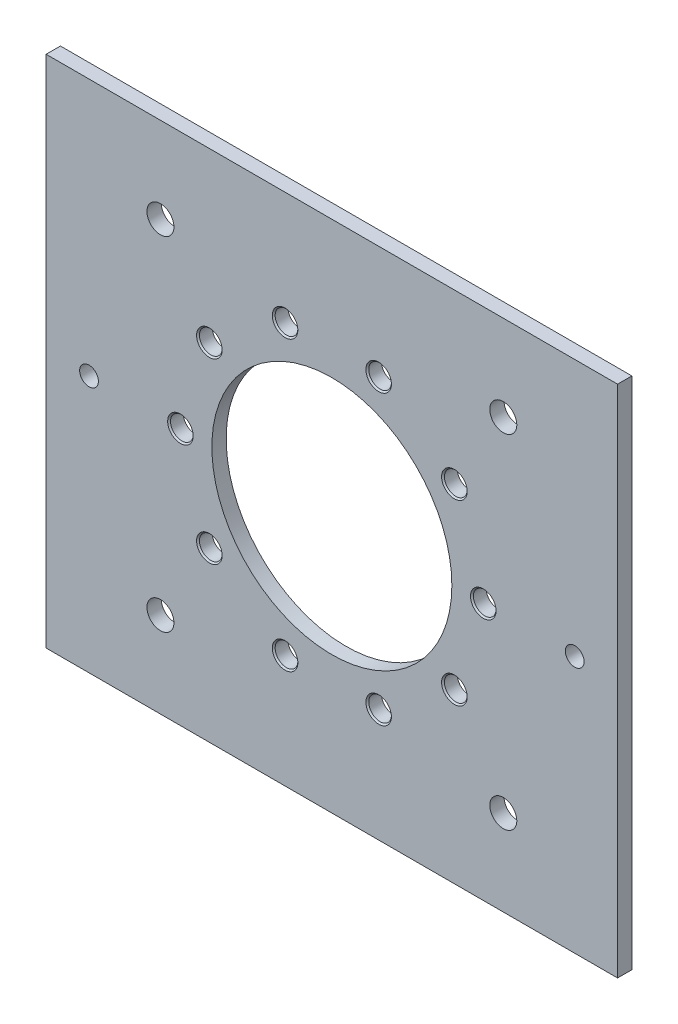
ISO-10303-21;
HEADER;
FILE_DESCRIPTION(('STEP AP214'),'2;1');
FILE_NAME('part.step','',(''),(''),'','','');
FILE_SCHEMA(('AUTOMOTIVE_DESIGN { 1 0 10303 214 1 1 1 1 }'));
ENDSEC;
DATA;
#1=APPLICATION_CONTEXT('core data for automotive mechanical design processes');
#2=APPLICATION_PROTOCOL_DEFINITION('international standard','automotive_design',2000,#1);
#3=PRODUCT_CONTEXT('',#1,'mechanical');
#4=PRODUCT('Part','Part','',(#3));
#5=PRODUCT_RELATED_PRODUCT_CATEGORY('part','',(#4));
#6=PRODUCT_DEFINITION_FORMATION('','',#4);
#7=PRODUCT_DEFINITION_CONTEXT('part definition',#1,'design');
#8=PRODUCT_DEFINITION('design','',#6,#7);
#9=PRODUCT_DEFINITION_SHAPE('','',#8);
#10=(LENGTH_UNIT() NAMED_UNIT(*) SI_UNIT(.MILLI.,.METRE.));
#11=(NAMED_UNIT(*) PLANE_ANGLE_UNIT() SI_UNIT($,.RADIAN.));
#12=(NAMED_UNIT(*) SI_UNIT($,.STERADIAN.) SOLID_ANGLE_UNIT());
#13=UNCERTAINTY_MEASURE_WITH_UNIT(LENGTH_MEASURE(1.E-05),#10,'distance_accuracy_value','');
#14=(GEOMETRIC_REPRESENTATION_CONTEXT(3) GLOBAL_UNCERTAINTY_ASSIGNED_CONTEXT((#13)) GLOBAL_UNIT_ASSIGNED_CONTEXT((#10,
#11,#12)) REPRESENTATION_CONTEXT('',''));
#15=CARTESIAN_POINT('',(0.,0.,0.));
#16=DIRECTION('',(0.,0.,1.));
#17=DIRECTION('',(1.,0.,0.));
#18=AXIS2_PLACEMENT_3D('',#15,#16,#17);
#19=CARTESIAN_POINT('',(0.,0.,6.35));
#20=DIRECTION('',(0.,0.,-1.));
#21=DIRECTION('',(-1.,0.,0.));
#22=AXIS2_PLACEMENT_3D('',#19,#20,#21);
#23=PLANE('',#22);
#24=CARTESIAN_POINT('',(-107.95,0.,6.35));
#25=DIRECTION('',(0.,0.,-1.));
#26=DIRECTION('',(-1.,0.,0.));
#27=AXIS2_PLACEMENT_3D('',#24,#25,#26);
#28=CIRCLE('',#27,4.1656);
#29=CARTESIAN_POINT('',(-112.1156,0.,6.35));
#30=VERTEX_POINT('',#29);
#31=EDGE_CURVE('E289',#30,#30,#28,.T.);
#32=ORIENTED_EDGE('',*,*,#31,.T.);
#33=EDGE_LOOP('',(#32));
#34=FACE_BOUND('',#33,.T.);
#35=CARTESIAN_POINT('',(107.95,0.,6.35));
#36=DIRECTION('',(0.,0.,-1.));
#37=DIRECTION('',(1.,0.,0.));
#38=AXIS2_PLACEMENT_3D('',#35,#36,#37);
#39=CIRCLE('',#38,4.1656);
#40=CARTESIAN_POINT('',(112.1156,0.,6.35));
#41=VERTEX_POINT('',#40);
#42=EDGE_CURVE('E294',#41,#41,#39,.T.);
#43=ORIENTED_EDGE('',*,*,#42,.T.);
#44=EDGE_LOOP('',(#43));
#45=FACE_BOUND('',#44,.T.);
#46=CARTESIAN_POINT('',(-76.2,76.2,6.35));
#47=DIRECTION('',(0.,0.,-1.));
#48=DIRECTION('',(-1.,0.,0.));
#49=AXIS2_PLACEMENT_3D('',#46,#47,#48);
#50=CIRCLE('',#49,6.00000000000001);
#51=CARTESIAN_POINT('',(-82.2,76.2,6.35));
#52=VERTEX_POINT('',#51);
#53=EDGE_CURVE('E281',#52,#52,#50,.T.);
#54=ORIENTED_EDGE('',*,*,#53,.T.);
#55=EDGE_LOOP('',(#54));
#56=FACE_BOUND('',#55,.T.);
#57=CARTESIAN_POINT('',(-76.2,-76.2,6.35));
#58=DIRECTION('',(0.,0.,-1.));
#59=DIRECTION('',(-1.,0.,0.));
#60=AXIS2_PLACEMENT_3D('',#57,#58,#59);
#61=CIRCLE('',#60,6.00000000000001);
#62=CARTESIAN_POINT('',(-82.2,-76.2,6.35));
#63=VERTEX_POINT('',#62);
#64=EDGE_CURVE('E273',#63,#63,#61,.T.);
#65=ORIENTED_EDGE('',*,*,#64,.T.);
#66=EDGE_LOOP('',(#65));
#67=FACE_BOUND('',#66,.T.);
#68=CARTESIAN_POINT('',(76.1999999999999,-76.2,6.35));
#69=DIRECTION('',(0.,0.,-1.));
#70=DIRECTION('',(-1.,0.,0.));
#71=AXIS2_PLACEMENT_3D('',#68,#69,#70);
#72=CIRCLE('',#71,6.00000000000001);
#73=CARTESIAN_POINT('',(70.1999999999999,-76.2,6.35));
#74=VERTEX_POINT('',#73);
#75=EDGE_CURVE('E265',#74,#74,#72,.T.);
#76=ORIENTED_EDGE('',*,*,#75,.T.);
#77=EDGE_LOOP('',(#76));
#78=FACE_BOUND('',#77,.T.);
#79=CARTESIAN_POINT('',(76.2,76.2,6.35));
#80=DIRECTION('',(0.,0.,-1.));
#81=DIRECTION('',(-1.,0.,0.));
#82=AXIS2_PLACEMENT_3D('',#79,#80,#81);
#83=CIRCLE('',#82,6.00000000000001);
#84=CARTESIAN_POINT('',(70.2,76.2,6.35));
#85=VERTEX_POINT('',#84);
#86=EDGE_CURVE('E257',#85,#85,#83,.T.);
#87=ORIENTED_EDGE('',*,*,#86,.T.);
#88=EDGE_LOOP('',(#87));
#89=FACE_BOUND('',#88,.T.);
#90=CARTESIAN_POINT('',(-67.31,0.,6.35));
#91=DIRECTION('',(0.,0.,1.));
#92=DIRECTION('',(1.,0.,0.));
#93=AXIS2_PLACEMENT_3D('',#90,#91,#92);
#94=CIRCLE('',#93,5.6769);
#95=CARTESIAN_POINT('',(-61.6331,0.,6.35));
#96=VERTEX_POINT('',#95);
#97=EDGE_CURVE('E253',#96,#96,#94,.T.);
#98=ORIENTED_EDGE('',*,*,#97,.F.);
#99=EDGE_LOOP('',(#98));
#100=FACE_BOUND('',#99,.T.);
#101=CARTESIAN_POINT('',(-54.4549338913777,39.5638253318064,6.35));
#102=DIRECTION('',(0.,0.,1.));
#103=DIRECTION('',(1.,0.,0.));
#104=AXIS2_PLACEMENT_3D('',#101,#102,#103);
#105=CIRCLE('',#104,5.6769);
#106=CARTESIAN_POINT('',(-48.7780338913777,39.5638253318064,6.35));
#107=VERTEX_POINT('',#106);
#108=EDGE_CURVE('E241',#107,#107,#105,.T.);
#109=ORIENTED_EDGE('',*,*,#108,.F.);
#110=EDGE_LOOP('',(#109));
#111=FACE_BOUND('',#110,.T.);
#112=CARTESIAN_POINT('',(-20.7999338913775,64.0156141118268,6.35));
#113=DIRECTION('',(0.,0.,1.));
#114=DIRECTION('',(1.,0.,0.));
#115=AXIS2_PLACEMENT_3D('',#112,#113,#114);
#116=CIRCLE('',#115,5.6769);
#117=CARTESIAN_POINT('',(-15.1230338913775,64.0156141118268,6.35));
#118=VERTEX_POINT('',#117);
#119=EDGE_CURVE('E229',#118,#118,#116,.T.);
#120=ORIENTED_EDGE('',*,*,#119,.F.);
#121=EDGE_LOOP('',(#120));
#122=FACE_BOUND('',#121,.T.);
#123=CARTESIAN_POINT('',(20.799933891378,64.0156141118267,6.35));
#124=DIRECTION('',(0.,0.,1.));
#125=DIRECTION('',(1.,0.,0.));
#126=AXIS2_PLACEMENT_3D('',#123,#124,#125);
#127=CIRCLE('',#126,5.6769);
#128=CARTESIAN_POINT('',(26.476833891378,64.0156141118267,6.35));
#129=VERTEX_POINT('',#128);
#130=EDGE_CURVE('E217',#129,#129,#127,.T.);
#131=ORIENTED_EDGE('',*,*,#130,.F.);
#132=EDGE_LOOP('',(#131));
#133=FACE_BOUND('',#132,.T.);
#134=CARTESIAN_POINT('',(54.4549338913779,39.5638253318061,6.35));
#135=DIRECTION('',(0.,0.,1.));
#136=DIRECTION('',(1.,0.,0.));
#137=AXIS2_PLACEMENT_3D('',#134,#135,#136);
#138=CIRCLE('',#137,5.6769);
#139=CARTESIAN_POINT('',(60.1318338913779,39.5638253318061,6.35));
#140=VERTEX_POINT('',#139);
#141=EDGE_CURVE('E205',#140,#140,#138,.T.);
#142=ORIENTED_EDGE('',*,*,#141,.F.);
#143=EDGE_LOOP('',(#142));
#144=FACE_BOUND('',#143,.T.);
#145=CARTESIAN_POINT('',(67.31,-4.70023217835063E-13,6.35));
#146=DIRECTION('',(0.,0.,1.));
#147=DIRECTION('',(1.,0.,0.));
#148=AXIS2_PLACEMENT_3D('',#145,#146,#147);
#149=CIRCLE('',#148,5.6769);
#150=CARTESIAN_POINT('',(72.9869,-4.70023217835063E-13,6.35));
#151=VERTEX_POINT('',#150);
#152=EDGE_CURVE('E193',#151,#151,#149,.T.);
#153=ORIENTED_EDGE('',*,*,#152,.F.);
#154=EDGE_LOOP('',(#153));
#155=FACE_BOUND('',#154,.T.);
#156=CARTESIAN_POINT('',(54.4549338913773,-39.5638253318068,6.35));
#157=DIRECTION('',(0.,0.,1.));
#158=DIRECTION('',(1.,0.,0.));
#159=AXIS2_PLACEMENT_3D('',#156,#157,#158);
#160=CIRCLE('',#159,5.6769);
#161=CARTESIAN_POINT('',(60.1318338913773,-39.5638253318068,6.35));
#162=VERTEX_POINT('',#161);
#163=EDGE_CURVE('E181',#162,#162,#160,.T.);
#164=ORIENTED_EDGE('',*,*,#163,.F.);
#165=EDGE_LOOP('',(#164));
#166=FACE_BOUND('',#165,.T.);
#167=CARTESIAN_POINT('',(20.7999338913771,-64.015614111827,6.35));
#168=DIRECTION('',(0.,0.,1.));
#169=DIRECTION('',(1.,0.,0.));
#170=AXIS2_PLACEMENT_3D('',#167,#168,#169);
#171=CIRCLE('',#170,5.6769);
#172=CARTESIAN_POINT('',(26.4768338913771,-64.015614111827,6.35));
#173=VERTEX_POINT('',#172);
#174=EDGE_CURVE('E169',#173,#173,#171,.T.);
#175=ORIENTED_EDGE('',*,*,#174,.F.);
#176=EDGE_LOOP('',(#175));
#177=FACE_BOUND('',#176,.T.);
#178=CARTESIAN_POINT('',(-20.7999338913784,-64.0156141118266,6.35));
#179=DIRECTION('',(0.,0.,1.));
#180=DIRECTION('',(1.,0.,0.));
#181=AXIS2_PLACEMENT_3D('',#178,#179,#180);
#182=CIRCLE('',#181,5.6769);
#183=CARTESIAN_POINT('',(-15.1230338913784,-64.0156141118266,6.35));
#184=VERTEX_POINT('',#183);
#185=EDGE_CURVE('E157',#184,#184,#182,.T.);
#186=ORIENTED_EDGE('',*,*,#185,.F.);
#187=EDGE_LOOP('',(#186));
#188=FACE_BOUND('',#187,.T.);
#189=CARTESIAN_POINT('',(-54.4549338913782,-39.5638253318057,6.35));
#190=DIRECTION('',(0.,0.,1.));
#191=DIRECTION('',(1.,0.,0.));
#192=AXIS2_PLACEMENT_3D('',#189,#190,#191);
#193=CIRCLE('',#192,5.6769);
#194=CARTESIAN_POINT('',(-48.7780338913782,-39.5638253318057,6.35));
#195=VERTEX_POINT('',#194);
#196=EDGE_CURVE('E145',#195,#195,#193,.T.);
#197=ORIENTED_EDGE('',*,*,#196,.F.);
#198=EDGE_LOOP('',(#197));
#199=FACE_BOUND('',#198,.T.);
#200=DIRECTION('',(0.,1.,0.));
#201=VECTOR('',#200,1.);
#202=CARTESIAN_POINT('',(127.,-114.3,6.35));
#203=LINE('',#202,#201);
#204=CARTESIAN_POINT('',(127.,-114.3,6.35));
#205=VERTEX_POINT('',#204);
#206=CARTESIAN_POINT('',(127.,114.3,6.35));
#207=VERTEX_POINT('',#206);
#208=EDGE_CURVE('E92',#205,#207,#203,.T.);
#209=ORIENTED_EDGE('',*,*,#208,.T.);
#210=DIRECTION('',(-1.,0.,0.));
#211=VECTOR('',#210,1.);
#212=CARTESIAN_POINT('',(-127.,114.3,6.35));
#213=LINE('',#212,#211);
#214=CARTESIAN_POINT('',(-127.,114.3,6.35));
#215=VERTEX_POINT('',#214);
#216=EDGE_CURVE('E87',#207,#215,#213,.T.);
#217=ORIENTED_EDGE('',*,*,#216,.T.);
#218=DIRECTION('',(0.,-1.,0.));
#219=VECTOR('',#218,1.);
#220=CARTESIAN_POINT('',(-127.,-114.3,6.35));
#221=LINE('',#220,#219);
#222=CARTESIAN_POINT('',(-127.,-114.3,6.35));
#223=VERTEX_POINT('',#222);
#224=EDGE_CURVE('E90',#215,#223,#221,.T.);
#225=ORIENTED_EDGE('',*,*,#224,.T.);
#226=DIRECTION('',(1.,0.,0.));
#227=VECTOR('',#226,1.);
#228=CARTESIAN_POINT('',(-127.,-114.3,6.35));
#229=LINE('',#228,#227);
#230=EDGE_CURVE('E57',#223,#205,#229,.T.);
#231=ORIENTED_EDGE('',*,*,#230,.T.);
#232=EDGE_LOOP('',(#209,#217,#225,#231));
#233=FACE_BOUND('',#232,.T.);
#234=CARTESIAN_POINT('',(0.,0.,6.35));
#235=DIRECTION('',(0.,0.,1.));
#236=DIRECTION('',(1.,0.,0.));
#237=AXIS2_PLACEMENT_3D('',#234,#235,#236);
#238=CIRCLE('',#237,53.34);
#239=CARTESIAN_POINT('',(53.34,0.,6.35));
#240=VERTEX_POINT('',#239);
#241=EDGE_CURVE('E112',#240,#240,#238,.T.);
#242=ORIENTED_EDGE('',*,*,#241,.F.);
#243=EDGE_LOOP('',(#242));
#244=FACE_BOUND('',#243,.T.);
#245=ADVANCED_FACE('F39',(#34,#45,#56,#67,#78,#89,#100,#111,#122,#133,#144,#155,#166,#177,#188,
#199,#233,#244),#23,.F.);
#246=CARTESIAN_POINT('',(0.,0.,0.));
#247=DIRECTION('',(0.,0.,-1.));
#248=DIRECTION('',(-1.,0.,0.));
#249=AXIS2_PLACEMENT_3D('',#246,#247,#248);
#250=PLANE('',#249);
#251=CARTESIAN_POINT('',(-107.95,0.,0.));
#252=DIRECTION('',(0.,0.,-1.));
#253=DIRECTION('',(-1.,0.,0.));
#254=AXIS2_PLACEMENT_3D('',#251,#252,#253);
#255=CIRCLE('',#254,4.1656);
#256=CARTESIAN_POINT('',(-112.1156,0.,0.));
#257=VERTEX_POINT('',#256);
#258=EDGE_CURVE('E298',#257,#257,#255,.T.);
#259=ORIENTED_EDGE('',*,*,#258,.F.);
#260=EDGE_LOOP('',(#259));
#261=FACE_BOUND('',#260,.T.);
#262=CARTESIAN_POINT('',(107.95,0.,0.));
#263=DIRECTION('',(0.,0.,-1.));
#264=DIRECTION('',(1.,0.,0.));
#265=AXIS2_PLACEMENT_3D('',#262,#263,#264);
#266=CIRCLE('',#265,4.1656);
#267=CARTESIAN_POINT('',(112.1156,0.,0.));
#268=VERTEX_POINT('',#267);
#269=EDGE_CURVE('E290',#268,#268,#266,.T.);
#270=ORIENTED_EDGE('',*,*,#269,.F.);
#271=EDGE_LOOP('',(#270));
#272=FACE_BOUND('',#271,.T.);
#273=CARTESIAN_POINT('',(-76.2,76.2,0.));
#274=DIRECTION('',(0.,0.,-1.));
#275=DIRECTION('',(-1.,0.,0.));
#276=AXIS2_PLACEMENT_3D('',#273,#274,#275);
#277=CIRCLE('',#276,6.00000000000001);
#278=CARTESIAN_POINT('',(-82.2,76.2,0.));
#279=VERTEX_POINT('',#278);
#280=EDGE_CURVE('E285',#279,#279,#277,.T.);
#281=ORIENTED_EDGE('',*,*,#280,.F.);
#282=EDGE_LOOP('',(#281));
#283=FACE_BOUND('',#282,.T.);
#284=CARTESIAN_POINT('',(-76.2,-76.2,0.));
#285=DIRECTION('',(0.,0.,-1.));
#286=DIRECTION('',(-1.,0.,0.));
#287=AXIS2_PLACEMENT_3D('',#284,#285,#286);
#288=CIRCLE('',#287,6.00000000000001);
#289=CARTESIAN_POINT('',(-82.2,-76.2,0.));
#290=VERTEX_POINT('',#289);
#291=EDGE_CURVE('E277',#290,#290,#288,.T.);
#292=ORIENTED_EDGE('',*,*,#291,.F.);
#293=EDGE_LOOP('',(#292));
#294=FACE_BOUND('',#293,.T.);
#295=CARTESIAN_POINT('',(76.1999999999999,-76.2,0.));
#296=DIRECTION('',(0.,0.,-1.));
#297=DIRECTION('',(-1.,0.,0.));
#298=AXIS2_PLACEMENT_3D('',#295,#296,#297);
#299=CIRCLE('',#298,6.00000000000001);
#300=CARTESIAN_POINT('',(70.1999999999999,-76.2,0.));
#301=VERTEX_POINT('',#300);
#302=EDGE_CURVE('E269',#301,#301,#299,.T.);
#303=ORIENTED_EDGE('',*,*,#302,.F.);
#304=EDGE_LOOP('',(#303));
#305=FACE_BOUND('',#304,.T.);
#306=CARTESIAN_POINT('',(76.2,76.2,0.));
#307=DIRECTION('',(0.,0.,-1.));
#308=DIRECTION('',(-1.,0.,0.));
#309=AXIS2_PLACEMENT_3D('',#306,#307,#308);
#310=CIRCLE('',#309,6.00000000000001);
#311=CARTESIAN_POINT('',(70.2,76.2,0.));
#312=VERTEX_POINT('',#311);
#313=EDGE_CURVE('E261',#312,#312,#310,.T.);
#314=ORIENTED_EDGE('',*,*,#313,.F.);
#315=EDGE_LOOP('',(#314));
#316=FACE_BOUND('',#315,.T.);
#317=CARTESIAN_POINT('',(-67.31,0.,0.));
#318=DIRECTION('',(0.,0.,1.));
#319=DIRECTION('',(1.,0.,0.));
#320=AXIS2_PLACEMENT_3D('',#317,#318,#319);
#321=CIRCLE('',#320,5.04189999999999);
#322=CARTESIAN_POINT('',(-62.2681,0.,0.));
#323=VERTEX_POINT('',#322);
#324=EDGE_CURVE('E245',#323,#323,#321,.T.);
#325=ORIENTED_EDGE('',*,*,#324,.T.);
#326=EDGE_LOOP('',(#325));
#327=FACE_BOUND('',#326,.T.);
#328=CARTESIAN_POINT('',(-54.4549338913777,39.5638253318064,0.));
#329=DIRECTION('',(0.,0.,1.));
#330=DIRECTION('',(1.,0.,0.));
#331=AXIS2_PLACEMENT_3D('',#328,#329,#330);
#332=CIRCLE('',#331,5.04189999999999);
#333=CARTESIAN_POINT('',(-49.4130338913777,39.5638253318064,0.));
#334=VERTEX_POINT('',#333);
#335=EDGE_CURVE('E233',#334,#334,#332,.T.);
#336=ORIENTED_EDGE('',*,*,#335,.T.);
#337=EDGE_LOOP('',(#336));
#338=FACE_BOUND('',#337,.T.);
#339=CARTESIAN_POINT('',(-20.7999338913775,64.0156141118268,0.));
#340=DIRECTION('',(0.,0.,1.));
#341=DIRECTION('',(1.,0.,0.));
#342=AXIS2_PLACEMENT_3D('',#339,#340,#341);
#343=CIRCLE('',#342,5.04189999999999);
#344=CARTESIAN_POINT('',(-15.7580338913775,64.0156141118268,0.));
#345=VERTEX_POINT('',#344);
#346=EDGE_CURVE('E221',#345,#345,#343,.T.);
#347=ORIENTED_EDGE('',*,*,#346,.T.);
#348=EDGE_LOOP('',(#347));
#349=FACE_BOUND('',#348,.T.);
#350=CARTESIAN_POINT('',(20.799933891378,64.0156141118267,0.));
#351=DIRECTION('',(0.,0.,1.));
#352=DIRECTION('',(1.,0.,0.));
#353=AXIS2_PLACEMENT_3D('',#350,#351,#352);
#354=CIRCLE('',#353,5.04189999999999);
#355=CARTESIAN_POINT('',(25.841833891378,64.0156141118267,0.));
#356=VERTEX_POINT('',#355);
#357=EDGE_CURVE('E209',#356,#356,#354,.T.);
#358=ORIENTED_EDGE('',*,*,#357,.T.);
#359=EDGE_LOOP('',(#358));
#360=FACE_BOUND('',#359,.T.);
#361=CARTESIAN_POINT('',(54.4549338913779,39.5638253318061,0.));
#362=DIRECTION('',(0.,0.,1.));
#363=DIRECTION('',(1.,0.,0.));
#364=AXIS2_PLACEMENT_3D('',#361,#362,#363);
#365=CIRCLE('',#364,5.04189999999999);
#366=CARTESIAN_POINT('',(59.4968338913779,39.5638253318061,0.));
#367=VERTEX_POINT('',#366);
#368=EDGE_CURVE('E197',#367,#367,#365,.T.);
#369=ORIENTED_EDGE('',*,*,#368,.T.);
#370=EDGE_LOOP('',(#369));
#371=FACE_BOUND('',#370,.T.);
#372=CARTESIAN_POINT('',(67.31,-4.70023217835063E-13,0.));
#373=DIRECTION('',(0.,0.,1.));
#374=DIRECTION('',(1.,0.,0.));
#375=AXIS2_PLACEMENT_3D('',#372,#373,#374);
#376=CIRCLE('',#375,5.04189999999999);
#377=CARTESIAN_POINT('',(72.3519,-4.70023217835063E-13,0.));
#378=VERTEX_POINT('',#377);
#379=EDGE_CURVE('E185',#378,#378,#376,.T.);
#380=ORIENTED_EDGE('',*,*,#379,.T.);
#381=EDGE_LOOP('',(#380));
#382=FACE_BOUND('',#381,.T.);
#383=CARTESIAN_POINT('',(54.4549338913773,-39.5638253318068,0.));
#384=DIRECTION('',(0.,0.,1.));
#385=DIRECTION('',(1.,0.,0.));
#386=AXIS2_PLACEMENT_3D('',#383,#384,#385);
#387=CIRCLE('',#386,5.04189999999999);
#388=CARTESIAN_POINT('',(59.4968338913773,-39.5638253318068,0.));
#389=VERTEX_POINT('',#388);
#390=EDGE_CURVE('E173',#389,#389,#387,.T.);
#391=ORIENTED_EDGE('',*,*,#390,.T.);
#392=EDGE_LOOP('',(#391));
#393=FACE_BOUND('',#392,.T.);
#394=CARTESIAN_POINT('',(20.7999338913771,-64.015614111827,0.));
#395=DIRECTION('',(0.,0.,1.));
#396=DIRECTION('',(1.,0.,0.));
#397=AXIS2_PLACEMENT_3D('',#394,#395,#396);
#398=CIRCLE('',#397,5.04189999999999);
#399=CARTESIAN_POINT('',(25.8418338913771,-64.015614111827,0.));
#400=VERTEX_POINT('',#399);
#401=EDGE_CURVE('E161',#400,#400,#398,.T.);
#402=ORIENTED_EDGE('',*,*,#401,.T.);
#403=EDGE_LOOP('',(#402));
#404=FACE_BOUND('',#403,.T.);
#405=CARTESIAN_POINT('',(-20.7999338913784,-64.0156141118266,0.));
#406=DIRECTION('',(0.,0.,1.));
#407=DIRECTION('',(1.,0.,0.));
#408=AXIS2_PLACEMENT_3D('',#405,#406,#407);
#409=CIRCLE('',#408,5.04189999999999);
#410=CARTESIAN_POINT('',(-15.7580338913784,-64.0156141118266,0.));
#411=VERTEX_POINT('',#410);
#412=EDGE_CURVE('E149',#411,#411,#409,.T.);
#413=ORIENTED_EDGE('',*,*,#412,.T.);
#414=EDGE_LOOP('',(#413));
#415=FACE_BOUND('',#414,.T.);
#416=CARTESIAN_POINT('',(-54.4549338913782,-39.5638253318057,0.));
#417=DIRECTION('',(0.,0.,1.));
#418=DIRECTION('',(1.,0.,0.));
#419=AXIS2_PLACEMENT_3D('',#416,#417,#418);
#420=CIRCLE('',#419,5.04189999999999);
#421=CARTESIAN_POINT('',(-49.4130338913782,-39.5638253318057,0.));
#422=VERTEX_POINT('',#421);
#423=EDGE_CURVE('E134',#422,#422,#420,.T.);
#424=ORIENTED_EDGE('',*,*,#423,.T.);
#425=EDGE_LOOP('',(#424));
#426=FACE_BOUND('',#425,.T.);
#427=DIRECTION('',(0.,1.,0.));
#428=VECTOR('',#427,1.);
#429=CARTESIAN_POINT('',(127.,-114.3,0.));
#430=LINE('',#429,#428);
#431=CARTESIAN_POINT('',(127.,-114.3,0.));
#432=VERTEX_POINT('',#431);
#433=CARTESIAN_POINT('',(127.,114.3,0.));
#434=VERTEX_POINT('',#433);
#435=EDGE_CURVE('E108',#432,#434,#430,.T.);
#436=ORIENTED_EDGE('',*,*,#435,.F.);
#437=DIRECTION('',(1.,0.,0.));
#438=VECTOR('',#437,1.);
#439=CARTESIAN_POINT('',(-127.,-114.3,0.));
#440=LINE('',#439,#438);
#441=CARTESIAN_POINT('',(-127.,-114.3,0.));
#442=VERTEX_POINT('',#441);
#443=EDGE_CURVE('E80',#442,#432,#440,.T.);
#444=ORIENTED_EDGE('',*,*,#443,.F.);
#445=DIRECTION('',(0.,-1.,0.));
#446=VECTOR('',#445,1.);
#447=CARTESIAN_POINT('',(-127.,-114.3,0.));
#448=LINE('',#447,#446);
#449=CARTESIAN_POINT('',(-127.,114.3,0.));
#450=VERTEX_POINT('',#449);
#451=EDGE_CURVE('E74',#450,#442,#448,.T.);
#452=ORIENTED_EDGE('',*,*,#451,.F.);
#453=DIRECTION('',(-1.,0.,0.));
#454=VECTOR('',#453,1.);
#455=CARTESIAN_POINT('',(-127.,114.3,0.));
#456=LINE('',#455,#454);
#457=EDGE_CURVE('E97',#434,#450,#456,.T.);
#458=ORIENTED_EDGE('',*,*,#457,.F.);
#459=EDGE_LOOP('',(#436,#444,#452,#458));
#460=FACE_BOUND('',#459,.T.);
#461=CARTESIAN_POINT('',(0.,0.,0.));
#462=DIRECTION('',(0.,0.,1.));
#463=DIRECTION('',(1.,0.,0.));
#464=AXIS2_PLACEMENT_3D('',#461,#462,#463);
#465=CIRCLE('',#464,53.34);
#466=CARTESIAN_POINT('',(53.34,0.,0.));
#467=VERTEX_POINT('',#466);
#468=EDGE_CURVE('E130',#467,#467,#465,.T.);
#469=ORIENTED_EDGE('',*,*,#468,.T.);
#470=EDGE_LOOP('',(#469));
#471=FACE_BOUND('',#470,.T.);
#472=ADVANCED_FACE('F125',(#261,#272,#283,#294,#305,#316,#327,#338,#349,#360,#371,#382,#393,
#404,#415,#426,#460,#471),#250,.T.);
#473=CARTESIAN_POINT('',(127.,-114.3,6.35));
#474=DIRECTION('',(-1.,0.,0.));
#475=DIRECTION('',(0.,0.,1.));
#476=AXIS2_PLACEMENT_3D('',#473,#474,#475);
#477=PLANE('',#476);
#478=ORIENTED_EDGE('',*,*,#435,.T.);
#479=DIRECTION('',(0.,0.,-1.));
#480=VECTOR('',#479,1.);
#481=CARTESIAN_POINT('',(127.,114.3,6.35));
#482=LINE('',#481,#480);
#483=EDGE_CURVE('E11',#207,#434,#482,.T.);
#484=ORIENTED_EDGE('',*,*,#483,.F.);
#485=ORIENTED_EDGE('',*,*,#208,.F.);
#486=DIRECTION('',(0.,0.,-1.));
#487=VECTOR('',#486,1.);
#488=CARTESIAN_POINT('',(127.,-114.3,6.35));
#489=LINE('',#488,#487);
#490=EDGE_CURVE('E104',#205,#432,#489,.T.);
#491=ORIENTED_EDGE('',*,*,#490,.T.);
#492=EDGE_LOOP('',(#478,#484,#485,#491));
#493=FACE_BOUND('',#492,.T.);
#494=ADVANCED_FACE('F41',(#493),#477,.F.);
#495=CARTESIAN_POINT('',(-127.,114.3,6.35));
#496=DIRECTION('',(0.,-1.,0.));
#497=DIRECTION('',(0.,0.,-1.));
#498=AXIS2_PLACEMENT_3D('',#495,#496,#497);
#499=PLANE('',#498);
#500=ORIENTED_EDGE('',*,*,#457,.T.);
#501=DIRECTION('',(0.,0.,-1.));
#502=VECTOR('',#501,1.);
#503=CARTESIAN_POINT('',(-127.,114.3,6.35));
#504=LINE('',#503,#502);
#505=EDGE_CURVE('E49',#215,#450,#504,.T.);
#506=ORIENTED_EDGE('',*,*,#505,.F.);
#507=ORIENTED_EDGE('',*,*,#216,.F.);
#508=ORIENTED_EDGE('',*,*,#483,.T.);
#509=EDGE_LOOP('',(#500,#506,#507,#508));
#510=FACE_BOUND('',#509,.T.);
#511=ADVANCED_FACE('F96',(#510),#499,.F.);
#512=CARTESIAN_POINT('',(-127.,-114.3,6.35));
#513=DIRECTION('',(1.,0.,0.));
#514=DIRECTION('',(0.,0.,-1.));
#515=AXIS2_PLACEMENT_3D('',#512,#513,#514);
#516=PLANE('',#515);
#517=ORIENTED_EDGE('',*,*,#451,.T.);
#518=DIRECTION('',(0.,0.,-1.));
#519=VECTOR('',#518,1.);
#520=CARTESIAN_POINT('',(-127.,-114.3,6.35));
#521=LINE('',#520,#519);
#522=EDGE_CURVE('E99',#223,#442,#521,.T.);
#523=ORIENTED_EDGE('',*,*,#522,.F.);
#524=ORIENTED_EDGE('',*,*,#224,.F.);
#525=ORIENTED_EDGE('',*,*,#505,.T.);
#526=EDGE_LOOP('',(#517,#523,#524,#525));
#527=FACE_BOUND('',#526,.T.);
#528=ADVANCED_FACE('F100',(#527),#516,.F.);
#529=CARTESIAN_POINT('',(-127.,-114.3,6.35));
#530=DIRECTION('',(0.,1.,0.));
#531=DIRECTION('',(0.,0.,1.));
#532=AXIS2_PLACEMENT_3D('',#529,#530,#531);
#533=PLANE('',#532);
#534=ORIENTED_EDGE('',*,*,#443,.T.);
#535=ORIENTED_EDGE('',*,*,#490,.F.);
#536=ORIENTED_EDGE('',*,*,#230,.F.);
#537=ORIENTED_EDGE('',*,*,#522,.T.);
#538=EDGE_LOOP('',(#534,#535,#536,#537));
#539=FACE_BOUND('',#538,.T.);
#540=ADVANCED_FACE('F122',(#539),#533,.F.);
#541=CARTESIAN_POINT('',(0.,0.,6.35));
#542=DIRECTION('',(0.,0.,-1.));
#543=DIRECTION('',(-1.,0.,0.));
#544=AXIS2_PLACEMENT_3D('',#541,#542,#543);
#545=CYLINDRICAL_SURFACE('',#544,53.34);
#546=ORIENTED_EDGE('',*,*,#241,.T.);
#547=EDGE_LOOP('',(#546));
#548=FACE_BOUND('',#547,.T.);
#549=ORIENTED_EDGE('',*,*,#468,.F.);
#550=EDGE_LOOP('',(#549));
#551=FACE_BOUND('',#550,.T.);
#552=ADVANCED_FACE('F352',(#548,#551),#545,.F.);
#553=CARTESIAN_POINT('',(-54.4549338913782,-39.5638253318057,6.35));
#554=DIRECTION('',(0.,0.,1.));
#555=DIRECTION('',(1.,0.,0.));
#556=AXIS2_PLACEMENT_3D('',#553,#554,#555);
#557=CYLINDRICAL_SURFACE('',#556,5.04189999999999);
#558=ORIENTED_EDGE('',*,*,#423,.F.);
#559=EDGE_LOOP('',(#558));
#560=FACE_BOUND('',#559,.T.);
#561=CARTESIAN_POINT('',(-54.4549338913782,-39.5638253318057,5.715));
#562=DIRECTION('',(0.,0.,1.));
#563=DIRECTION('',(1.,0.,0.));
#564=AXIS2_PLACEMENT_3D('',#561,#562,#563);
#565=CIRCLE('',#564,5.0419);
#566=CARTESIAN_POINT('',(-49.4130338913782,-39.5638253318057,5.715));
#567=VERTEX_POINT('',#566);
#568=EDGE_CURVE('E141',#567,#567,#565,.T.);
#569=ORIENTED_EDGE('',*,*,#568,.T.);
#570=EDGE_LOOP('',(#569));
#571=FACE_BOUND('',#570,.T.);
#572=ADVANCED_FACE('F348',(#560,#571),#557,.F.);
#573=CARTESIAN_POINT('',(-54.4549338913782,-39.5638253318057,6.35));
#574=DIRECTION('',(0.,0.,1.));
#575=DIRECTION('',(1.,0.,0.));
#576=AXIS2_PLACEMENT_3D('',#573,#574,#575);
#577=CONICAL_SURFACE('',#576,5.6769,0.785398163397446);
#578=ORIENTED_EDGE('',*,*,#568,.F.);
#579=EDGE_LOOP('',(#578));
#580=FACE_BOUND('',#579,.T.);
#581=ORIENTED_EDGE('',*,*,#196,.T.);
#582=EDGE_LOOP('',(#581));
#583=FACE_BOUND('',#582,.T.);
#584=ADVANCED_FACE('F351',(#580,#583),#577,.F.);
#585=CARTESIAN_POINT('',(-20.7999338913784,-64.0156141118266,6.35));
#586=DIRECTION('',(0.,0.,1.));
#587=DIRECTION('',(1.,0.,0.));
#588=AXIS2_PLACEMENT_3D('',#585,#586,#587);
#589=CYLINDRICAL_SURFACE('',#588,5.04189999999999);
#590=ORIENTED_EDGE('',*,*,#412,.F.);
#591=EDGE_LOOP('',(#590));
#592=FACE_BOUND('',#591,.T.);
#593=CARTESIAN_POINT('',(-20.7999338913784,-64.0156141118266,5.715));
#594=DIRECTION('',(0.,0.,1.));
#595=DIRECTION('',(1.,0.,0.));
#596=AXIS2_PLACEMENT_3D('',#593,#594,#595);
#597=CIRCLE('',#596,5.0419);
#598=CARTESIAN_POINT('',(-15.7580338913784,-64.0156141118266,5.715));
#599=VERTEX_POINT('',#598);
#600=EDGE_CURVE('E153',#599,#599,#597,.T.);
#601=ORIENTED_EDGE('',*,*,#600,.T.);
#602=EDGE_LOOP('',(#601));
#603=FACE_BOUND('',#602,.T.);
#604=ADVANCED_FACE('F358',(#592,#603),#589,.F.);
#605=CARTESIAN_POINT('',(-20.7999338913784,-64.0156141118266,6.35));
#606=DIRECTION('',(0.,0.,1.));
#607=DIRECTION('',(1.,0.,0.));
#608=AXIS2_PLACEMENT_3D('',#605,#606,#607);
#609=CONICAL_SURFACE('',#608,5.6769,0.785398163397448);
#610=ORIENTED_EDGE('',*,*,#600,.F.);
#611=EDGE_LOOP('',(#610));
#612=FACE_BOUND('',#611,.T.);
#613=ORIENTED_EDGE('',*,*,#185,.T.);
#614=EDGE_LOOP('',(#613));
#615=FACE_BOUND('',#614,.T.);
#616=ADVANCED_FACE('F559',(#612,#615),#609,.F.);
#617=CARTESIAN_POINT('',(20.7999338913771,-64.015614111827,6.35));
#618=DIRECTION('',(0.,0.,1.));
#619=DIRECTION('',(1.,0.,0.));
#620=AXIS2_PLACEMENT_3D('',#617,#618,#619);
#621=CYLINDRICAL_SURFACE('',#620,5.04189999999999);
#622=ORIENTED_EDGE('',*,*,#401,.F.);
#623=EDGE_LOOP('',(#622));
#624=FACE_BOUND('',#623,.T.);
#625=CARTESIAN_POINT('',(20.7999338913771,-64.015614111827,5.715));
#626=DIRECTION('',(0.,0.,1.));
#627=DIRECTION('',(1.,0.,0.));
#628=AXIS2_PLACEMENT_3D('',#625,#626,#627);
#629=CIRCLE('',#628,5.0419);
#630=CARTESIAN_POINT('',(25.8418338913771,-64.015614111827,5.715));
#631=VERTEX_POINT('',#630);
#632=EDGE_CURVE('E165',#631,#631,#629,.T.);
#633=ORIENTED_EDGE('',*,*,#632,.T.);
#634=EDGE_LOOP('',(#633));
#635=FACE_BOUND('',#634,.T.);
#636=ADVANCED_FACE('F551',(#624,#635),#621,.F.);
#637=CARTESIAN_POINT('',(20.7999338913771,-64.015614111827,6.35));
#638=DIRECTION('',(0.,0.,1.));
#639=DIRECTION('',(1.,0.,0.));
#640=AXIS2_PLACEMENT_3D('',#637,#638,#639);
#641=CONICAL_SURFACE('',#640,5.6769,0.785398163397448);
#642=ORIENTED_EDGE('',*,*,#632,.F.);
#643=EDGE_LOOP('',(#642));
#644=FACE_BOUND('',#643,.T.);
#645=ORIENTED_EDGE('',*,*,#174,.T.);
#646=EDGE_LOOP('',(#645));
#647=FACE_BOUND('',#646,.T.);
#648=ADVANCED_FACE('F543',(#644,#647),#641,.F.);
#649=CARTESIAN_POINT('',(54.4549338913773,-39.5638253318068,6.35));
#650=DIRECTION('',(0.,0.,1.));
#651=DIRECTION('',(1.,0.,0.));
#652=AXIS2_PLACEMENT_3D('',#649,#650,#651);
#653=CYLINDRICAL_SURFACE('',#652,5.04189999999999);
#654=ORIENTED_EDGE('',*,*,#390,.F.);
#655=EDGE_LOOP('',(#654));
#656=FACE_BOUND('',#655,.T.);
#657=CARTESIAN_POINT('',(54.4549338913773,-39.5638253318068,5.715));
#658=DIRECTION('',(0.,0.,1.));
#659=DIRECTION('',(1.,0.,0.));
#660=AXIS2_PLACEMENT_3D('',#657,#658,#659);
#661=CIRCLE('',#660,5.0419);
#662=CARTESIAN_POINT('',(59.4968338913773,-39.5638253318068,5.715));
#663=VERTEX_POINT('',#662);
#664=EDGE_CURVE('E177',#663,#663,#661,.T.);
#665=ORIENTED_EDGE('',*,*,#664,.T.);
#666=EDGE_LOOP('',(#665));
#667=FACE_BOUND('',#666,.T.);
#668=ADVANCED_FACE('F535',(#656,#667),#653,.F.);
#669=CARTESIAN_POINT('',(54.4549338913773,-39.5638253318068,6.35));
#670=DIRECTION('',(0.,0.,1.));
#671=DIRECTION('',(1.,0.,0.));
#672=AXIS2_PLACEMENT_3D('',#669,#670,#671);
#673=CONICAL_SURFACE('',#672,5.6769,0.785398163397446);
#674=ORIENTED_EDGE('',*,*,#664,.F.);
#675=EDGE_LOOP('',(#674));
#676=FACE_BOUND('',#675,.T.);
#677=ORIENTED_EDGE('',*,*,#163,.T.);
#678=EDGE_LOOP('',(#677));
#679=FACE_BOUND('',#678,.T.);
#680=ADVANCED_FACE('F527',(#676,#679),#673,.F.);
#681=CARTESIAN_POINT('',(67.31,-4.70023217835063E-13,6.35));
#682=DIRECTION('',(0.,0.,1.));
#683=DIRECTION('',(1.,0.,0.));
#684=AXIS2_PLACEMENT_3D('',#681,#682,#683);
#685=CYLINDRICAL_SURFACE('',#684,5.04189999999999);
#686=ORIENTED_EDGE('',*,*,#379,.F.);
#687=EDGE_LOOP('',(#686));
#688=FACE_BOUND('',#687,.T.);
#689=CARTESIAN_POINT('',(67.31,-4.70023217835063E-13,5.715));
#690=DIRECTION('',(0.,0.,1.));
#691=DIRECTION('',(1.,0.,0.));
#692=AXIS2_PLACEMENT_3D('',#689,#690,#691);
#693=CIRCLE('',#692,5.0419);
#694=CARTESIAN_POINT('',(72.3519,-4.70023217835063E-13,5.715));
#695=VERTEX_POINT('',#694);
#696=EDGE_CURVE('E189',#695,#695,#693,.T.);
#697=ORIENTED_EDGE('',*,*,#696,.T.);
#698=EDGE_LOOP('',(#697));
#699=FACE_BOUND('',#698,.T.);
#700=ADVANCED_FACE('F519',(#688,#699),#685,.F.);
#701=CARTESIAN_POINT('',(67.31,-4.70023217835063E-13,6.35));
#702=DIRECTION('',(0.,0.,1.));
#703=DIRECTION('',(1.,0.,0.));
#704=AXIS2_PLACEMENT_3D('',#701,#702,#703);
#705=CONICAL_SURFACE('',#704,5.6769,0.785398163397446);
#706=ORIENTED_EDGE('',*,*,#696,.F.);
#707=EDGE_LOOP('',(#706));
#708=FACE_BOUND('',#707,.T.);
#709=ORIENTED_EDGE('',*,*,#152,.T.);
#710=EDGE_LOOP('',(#709));
#711=FACE_BOUND('',#710,.T.);
#712=ADVANCED_FACE('F511',(#708,#711),#705,.F.);
#713=CARTESIAN_POINT('',(54.4549338913779,39.5638253318061,6.35));
#714=DIRECTION('',(0.,0.,1.));
#715=DIRECTION('',(1.,0.,0.));
#716=AXIS2_PLACEMENT_3D('',#713,#714,#715);
#717=CYLINDRICAL_SURFACE('',#716,5.04189999999999);
#718=ORIENTED_EDGE('',*,*,#368,.F.);
#719=EDGE_LOOP('',(#718));
#720=FACE_BOUND('',#719,.T.);
#721=CARTESIAN_POINT('',(54.4549338913779,39.5638253318061,5.715));
#722=DIRECTION('',(0.,0.,1.));
#723=DIRECTION('',(1.,0.,0.));
#724=AXIS2_PLACEMENT_3D('',#721,#722,#723);
#725=CIRCLE('',#724,5.0419);
#726=CARTESIAN_POINT('',(59.4968338913779,39.5638253318061,5.715));
#727=VERTEX_POINT('',#726);
#728=EDGE_CURVE('E201',#727,#727,#725,.T.);
#729=ORIENTED_EDGE('',*,*,#728,.T.);
#730=EDGE_LOOP('',(#729));
#731=FACE_BOUND('',#730,.T.);
#732=ADVANCED_FACE('F503',(#720,#731),#717,.F.);
#733=CARTESIAN_POINT('',(54.4549338913779,39.5638253318061,6.35));
#734=DIRECTION('',(0.,0.,1.));
#735=DIRECTION('',(1.,0.,0.));
#736=AXIS2_PLACEMENT_3D('',#733,#734,#735);
#737=CONICAL_SURFACE('',#736,5.6769,0.785398163397446);
#738=ORIENTED_EDGE('',*,*,#728,.F.);
#739=EDGE_LOOP('',(#738));
#740=FACE_BOUND('',#739,.T.);
#741=ORIENTED_EDGE('',*,*,#141,.T.);
#742=EDGE_LOOP('',(#741));
#743=FACE_BOUND('',#742,.T.);
#744=ADVANCED_FACE('F495',(#740,#743),#737,.F.);
#745=CARTESIAN_POINT('',(20.799933891378,64.0156141118267,6.35));
#746=DIRECTION('',(0.,0.,1.));
#747=DIRECTION('',(1.,0.,0.));
#748=AXIS2_PLACEMENT_3D('',#745,#746,#747);
#749=CYLINDRICAL_SURFACE('',#748,5.04189999999999);
#750=ORIENTED_EDGE('',*,*,#357,.F.);
#751=EDGE_LOOP('',(#750));
#752=FACE_BOUND('',#751,.T.);
#753=CARTESIAN_POINT('',(20.799933891378,64.0156141118267,5.715));
#754=DIRECTION('',(0.,0.,1.));
#755=DIRECTION('',(1.,0.,0.));
#756=AXIS2_PLACEMENT_3D('',#753,#754,#755);
#757=CIRCLE('',#756,5.0419);
#758=CARTESIAN_POINT('',(25.841833891378,64.0156141118267,5.715));
#759=VERTEX_POINT('',#758);
#760=EDGE_CURVE('E213',#759,#759,#757,.T.);
#761=ORIENTED_EDGE('',*,*,#760,.T.);
#762=EDGE_LOOP('',(#761));
#763=FACE_BOUND('',#762,.T.);
#764=ADVANCED_FACE('F487',(#752,#763),#749,.F.);
#765=CARTESIAN_POINT('',(20.799933891378,64.0156141118267,6.35));
#766=DIRECTION('',(0.,0.,1.));
#767=DIRECTION('',(1.,0.,0.));
#768=AXIS2_PLACEMENT_3D('',#765,#766,#767);
#769=CONICAL_SURFACE('',#768,5.6769,0.785398163397448);
#770=ORIENTED_EDGE('',*,*,#760,.F.);
#771=EDGE_LOOP('',(#770));
#772=FACE_BOUND('',#771,.T.);
#773=ORIENTED_EDGE('',*,*,#130,.T.);
#774=EDGE_LOOP('',(#773));
#775=FACE_BOUND('',#774,.T.);
#776=ADVANCED_FACE('F479',(#772,#775),#769,.F.);
#777=CARTESIAN_POINT('',(-20.7999338913775,64.0156141118268,6.35));
#778=DIRECTION('',(0.,0.,1.));
#779=DIRECTION('',(1.,0.,0.));
#780=AXIS2_PLACEMENT_3D('',#777,#778,#779);
#781=CYLINDRICAL_SURFACE('',#780,5.04189999999999);
#782=ORIENTED_EDGE('',*,*,#346,.F.);
#783=EDGE_LOOP('',(#782));
#784=FACE_BOUND('',#783,.T.);
#785=CARTESIAN_POINT('',(-20.7999338913775,64.0156141118268,5.715));
#786=DIRECTION('',(0.,0.,1.));
#787=DIRECTION('',(1.,0.,0.));
#788=AXIS2_PLACEMENT_3D('',#785,#786,#787);
#789=CIRCLE('',#788,5.0419);
#790=CARTESIAN_POINT('',(-15.7580338913775,64.0156141118268,5.715));
#791=VERTEX_POINT('',#790);
#792=EDGE_CURVE('E225',#791,#791,#789,.T.);
#793=ORIENTED_EDGE('',*,*,#792,.T.);
#794=EDGE_LOOP('',(#793));
#795=FACE_BOUND('',#794,.T.);
#796=ADVANCED_FACE('F471',(#784,#795),#781,.F.);
#797=CARTESIAN_POINT('',(-20.7999338913775,64.0156141118268,6.35));
#798=DIRECTION('',(0.,0.,1.));
#799=DIRECTION('',(1.,0.,0.));
#800=AXIS2_PLACEMENT_3D('',#797,#798,#799);
#801=CONICAL_SURFACE('',#800,5.6769,0.785398163397448);
#802=ORIENTED_EDGE('',*,*,#792,.F.);
#803=EDGE_LOOP('',(#802));
#804=FACE_BOUND('',#803,.T.);
#805=ORIENTED_EDGE('',*,*,#119,.T.);
#806=EDGE_LOOP('',(#805));
#807=FACE_BOUND('',#806,.T.);
#808=ADVANCED_FACE('F463',(#804,#807),#801,.F.);
#809=CARTESIAN_POINT('',(-54.4549338913777,39.5638253318064,6.35));
#810=DIRECTION('',(0.,0.,1.));
#811=DIRECTION('',(1.,0.,0.));
#812=AXIS2_PLACEMENT_3D('',#809,#810,#811);
#813=CYLINDRICAL_SURFACE('',#812,5.04189999999999);
#814=ORIENTED_EDGE('',*,*,#335,.F.);
#815=EDGE_LOOP('',(#814));
#816=FACE_BOUND('',#815,.T.);
#817=CARTESIAN_POINT('',(-54.4549338913777,39.5638253318064,5.715));
#818=DIRECTION('',(0.,0.,1.));
#819=DIRECTION('',(1.,0.,0.));
#820=AXIS2_PLACEMENT_3D('',#817,#818,#819);
#821=CIRCLE('',#820,5.0419);
#822=CARTESIAN_POINT('',(-49.4130338913777,39.5638253318064,5.715));
#823=VERTEX_POINT('',#822);
#824=EDGE_CURVE('E237',#823,#823,#821,.T.);
#825=ORIENTED_EDGE('',*,*,#824,.T.);
#826=EDGE_LOOP('',(#825));
#827=FACE_BOUND('',#826,.T.);
#828=ADVANCED_FACE('F455',(#816,#827),#813,.F.);
#829=CARTESIAN_POINT('',(-54.4549338913777,39.5638253318064,6.35));
#830=DIRECTION('',(0.,0.,1.));
#831=DIRECTION('',(1.,0.,0.));
#832=AXIS2_PLACEMENT_3D('',#829,#830,#831);
#833=CONICAL_SURFACE('',#832,5.6769,0.785398163397446);
#834=ORIENTED_EDGE('',*,*,#824,.F.);
#835=EDGE_LOOP('',(#834));
#836=FACE_BOUND('',#835,.T.);
#837=ORIENTED_EDGE('',*,*,#108,.T.);
#838=EDGE_LOOP('',(#837));
#839=FACE_BOUND('',#838,.T.);
#840=ADVANCED_FACE('F447',(#836,#839),#833,.F.);
#841=CARTESIAN_POINT('',(-67.31,0.,6.35));
#842=DIRECTION('',(0.,0.,1.));
#843=DIRECTION('',(1.,0.,0.));
#844=AXIS2_PLACEMENT_3D('',#841,#842,#843);
#845=CYLINDRICAL_SURFACE('',#844,5.04189999999999);
#846=ORIENTED_EDGE('',*,*,#324,.F.);
#847=EDGE_LOOP('',(#846));
#848=FACE_BOUND('',#847,.T.);
#849=CARTESIAN_POINT('',(-67.31,0.,5.715));
#850=DIRECTION('',(0.,0.,1.));
#851=DIRECTION('',(1.,0.,0.));
#852=AXIS2_PLACEMENT_3D('',#849,#850,#851);
#853=CIRCLE('',#852,5.0419);
#854=CARTESIAN_POINT('',(-62.2681,0.,5.715));
#855=VERTEX_POINT('',#854);
#856=EDGE_CURVE('E249',#855,#855,#853,.T.);
#857=ORIENTED_EDGE('',*,*,#856,.T.);
#858=EDGE_LOOP('',(#857));
#859=FACE_BOUND('',#858,.T.);
#860=ADVANCED_FACE('F439',(#848,#859),#845,.F.);
#861=CARTESIAN_POINT('',(-67.31,0.,6.35));
#862=DIRECTION('',(0.,0.,1.));
#863=DIRECTION('',(1.,0.,0.));
#864=AXIS2_PLACEMENT_3D('',#861,#862,#863);
#865=CONICAL_SURFACE('',#864,5.6769,0.785398163397446);
#866=ORIENTED_EDGE('',*,*,#856,.F.);
#867=EDGE_LOOP('',(#866));
#868=FACE_BOUND('',#867,.T.);
#869=ORIENTED_EDGE('',*,*,#97,.T.);
#870=EDGE_LOOP('',(#869));
#871=FACE_BOUND('',#870,.T.);
#872=ADVANCED_FACE('F431',(#868,#871),#865,.F.);
#873=CARTESIAN_POINT('',(76.2,76.2,0.));
#874=DIRECTION('',(0.,0.,-1.));
#875=DIRECTION('',(-1.,0.,0.));
#876=AXIS2_PLACEMENT_3D('',#873,#874,#875);
#877=CYLINDRICAL_SURFACE('',#876,6.00000000000001);
#878=ORIENTED_EDGE('',*,*,#86,.F.);
#879=EDGE_LOOP('',(#878));
#880=FACE_BOUND('',#879,.T.);
#881=ORIENTED_EDGE('',*,*,#313,.T.);
#882=EDGE_LOOP('',(#881));
#883=FACE_BOUND('',#882,.T.);
#884=ADVANCED_FACE('F423',(#880,#883),#877,.F.);
#885=CARTESIAN_POINT('',(76.1999999999999,-76.2,0.));
#886=DIRECTION('',(0.,0.,-1.));
#887=DIRECTION('',(-1.,0.,0.));
#888=AXIS2_PLACEMENT_3D('',#885,#886,#887);
#889=CYLINDRICAL_SURFACE('',#888,6.00000000000001);
#890=ORIENTED_EDGE('',*,*,#75,.F.);
#891=EDGE_LOOP('',(#890));
#892=FACE_BOUND('',#891,.T.);
#893=ORIENTED_EDGE('',*,*,#302,.T.);
#894=EDGE_LOOP('',(#893));
#895=FACE_BOUND('',#894,.T.);
#896=ADVANCED_FACE('F415',(#892,#895),#889,.F.);
#897=CARTESIAN_POINT('',(-76.2,-76.2,0.));
#898=DIRECTION('',(0.,0.,-1.));
#899=DIRECTION('',(-1.,0.,0.));
#900=AXIS2_PLACEMENT_3D('',#897,#898,#899);
#901=CYLINDRICAL_SURFACE('',#900,6.00000000000001);
#902=ORIENTED_EDGE('',*,*,#64,.F.);
#903=EDGE_LOOP('',(#902));
#904=FACE_BOUND('',#903,.T.);
#905=ORIENTED_EDGE('',*,*,#291,.T.);
#906=EDGE_LOOP('',(#905));
#907=FACE_BOUND('',#906,.T.);
#908=ADVANCED_FACE('F408',(#904,#907),#901,.F.);
#909=CARTESIAN_POINT('',(-76.2,76.2,0.));
#910=DIRECTION('',(0.,0.,-1.));
#911=DIRECTION('',(-1.,0.,0.));
#912=AXIS2_PLACEMENT_3D('',#909,#910,#911);
#913=CYLINDRICAL_SURFACE('',#912,6.00000000000001);
#914=ORIENTED_EDGE('',*,*,#53,.F.);
#915=EDGE_LOOP('',(#914));
#916=FACE_BOUND('',#915,.T.);
#917=ORIENTED_EDGE('',*,*,#280,.T.);
#918=EDGE_LOOP('',(#917));
#919=FACE_BOUND('',#918,.T.);
#920=ADVANCED_FACE('F393',(#916,#919),#913,.F.);
#921=CARTESIAN_POINT('',(107.95,0.,6.35));
#922=DIRECTION('',(0.,0.,-1.));
#923=DIRECTION('',(-1.,0.,0.));
#924=AXIS2_PLACEMENT_3D('',#921,#922,#923);
#925=CYLINDRICAL_SURFACE('',#924,4.1656);
#926=ORIENTED_EDGE('',*,*,#42,.F.);
#927=EDGE_LOOP('',(#926));
#928=FACE_BOUND('',#927,.T.);
#929=ORIENTED_EDGE('',*,*,#269,.T.);
#930=EDGE_LOOP('',(#929));
#931=FACE_BOUND('',#930,.T.);
#932=ADVANCED_FACE('F311',(#928,#931),#925,.F.);
#933=CARTESIAN_POINT('',(-107.95,0.,6.35));
#934=DIRECTION('',(0.,0.,-1.));
#935=DIRECTION('',(-1.,0.,0.));
#936=AXIS2_PLACEMENT_3D('',#933,#934,#935);
#937=CYLINDRICAL_SURFACE('',#936,4.1656);
#938=ORIENTED_EDGE('',*,*,#31,.F.);
#939=EDGE_LOOP('',(#938));
#940=FACE_BOUND('',#939,.T.);
#941=ORIENTED_EDGE('',*,*,#258,.T.);
#942=EDGE_LOOP('',(#941));
#943=FACE_BOUND('',#942,.T.);
#944=ADVANCED_FACE('F308',(#940,#943),#937,.F.);
#945=CLOSED_SHELL('',(#245,#472,#494,#511,#528,#540,#552,#572,#584,#604,#616,#636,#648,#668,
#680,#700,#712,#732,#744,#764,#776,#796,#808,#828,#840,#860,#872,#884,#896,#908,#920,#932,#944));
#946=MANIFOLD_SOLID_BREP('B2',#945);
#947=ADVANCED_BREP_SHAPE_REPRESENTATION('',(#18,#946),#14);
#948=SHAPE_DEFINITION_REPRESENTATION(#9,#947);
ENDSEC;
END-ISO-10303-21;
